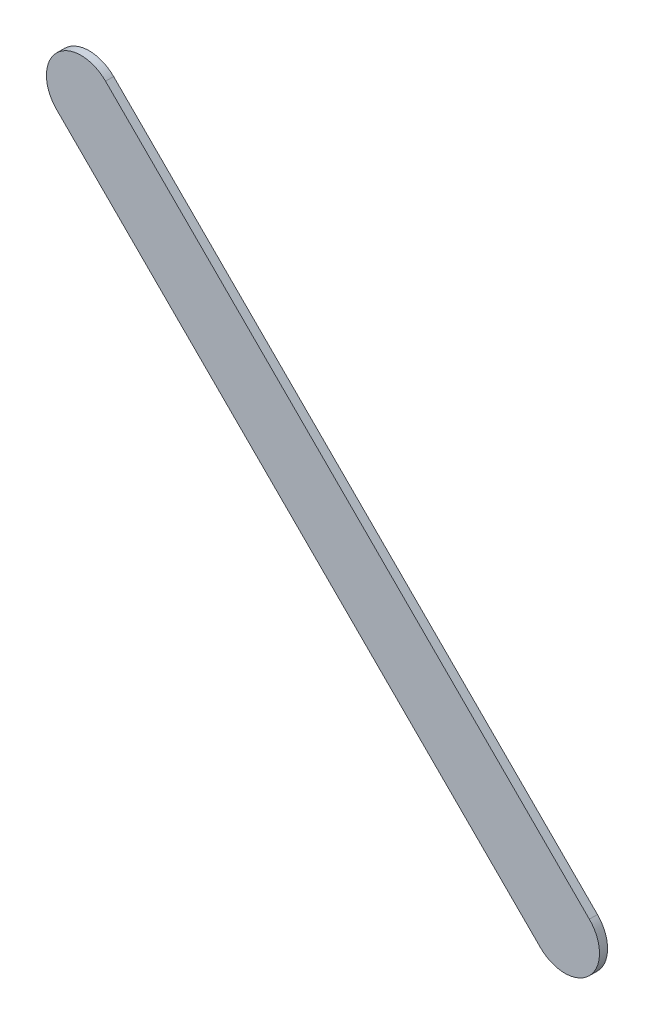
ISO-10303-21;
HEADER;
FILE_DESCRIPTION(('STEP AP214'),'2;1');
FILE_NAME('part.step','',(''),(''),'','','');
FILE_SCHEMA(('AUTOMOTIVE_DESIGN { 1 0 10303 214 1 1 1 1 }'));
ENDSEC;
DATA;
#1=APPLICATION_CONTEXT('core data for automotive mechanical design processes');
#2=APPLICATION_PROTOCOL_DEFINITION('international standard','automotive_design',2000,#1);
#3=PRODUCT_CONTEXT('',#1,'mechanical');
#4=PRODUCT('Part','Part','',(#3));
#5=PRODUCT_RELATED_PRODUCT_CATEGORY('part','',(#4));
#6=PRODUCT_DEFINITION_FORMATION('','',#4);
#7=PRODUCT_DEFINITION_CONTEXT('part definition',#1,'design');
#8=PRODUCT_DEFINITION('design','',#6,#7);
#9=PRODUCT_DEFINITION_SHAPE('','',#8);
#10=(LENGTH_UNIT() NAMED_UNIT(*) SI_UNIT(.MILLI.,.METRE.));
#11=(NAMED_UNIT(*) PLANE_ANGLE_UNIT() SI_UNIT($,.RADIAN.));
#12=(NAMED_UNIT(*) SI_UNIT($,.STERADIAN.) SOLID_ANGLE_UNIT());
#13=UNCERTAINTY_MEASURE_WITH_UNIT(LENGTH_MEASURE(1.E-05),#10,'distance_accuracy_value','');
#14=(GEOMETRIC_REPRESENTATION_CONTEXT(3) GLOBAL_UNCERTAINTY_ASSIGNED_CONTEXT((#13)) GLOBAL_UNIT_ASSIGNED_CONTEXT((#10,
#11,#12)) REPRESENTATION_CONTEXT('',''));
#15=CARTESIAN_POINT('',(0.,0.,0.));
#16=DIRECTION('',(0.,0.,1.));
#17=DIRECTION('',(1.,0.,0.));
#18=AXIS2_PLACEMENT_3D('',#15,#16,#17);
#19=CARTESIAN_POINT('',(123.766066,-113.903933,1.635));
#20=DIRECTION('',(0.,0.,1.));
#21=DIRECTION('',(1.,0.,0.));
#22=AXIS2_PLACEMENT_3D('',#19,#20,#21);
#23=PLANE('',#22);
#24=DIRECTION('',(-0.707106781186548,0.707106781186548,0.));
#25=VECTOR('',#24,1.);
#26=CARTESIAN_POINT('',(123.766066,-113.903933,1.635));
#27=LINE('',#26,#25);
#28=CARTESIAN_POINT('',(123.766066,-113.903933,1.635));
#29=VERTEX_POINT('',#28);
#30=CARTESIAN_POINT('',(121.671066,-111.808933,1.635));
#31=VERTEX_POINT('',#30);
#32=EDGE_CURVE('E91',#29,#31,#27,.T.);
#33=ORIENTED_EDGE('',*,*,#32,.T.);
#34=CARTESIAN_POINT('',(121.5649995,-111.9149995,1.635));
#35=DIRECTION('',(0.,0.,1.));
#36=DIRECTION('',(0.707106781186548,0.707106781186548,0.));
#37=AXIS2_PLACEMENT_3D('',#34,#35,#36);
#38=CIRCLE('',#37,0.150000682813);
#39=CARTESIAN_POINT('',(121.458933,-112.021066,1.635));
#40=VERTEX_POINT('',#39);
#41=EDGE_CURVE('E86',#31,#40,#38,.T.);
#42=ORIENTED_EDGE('',*,*,#41,.T.);
#43=DIRECTION('',(0.707106781186548,-0.707106781186548,0.));
#44=VECTOR('',#43,1.);
#45=CARTESIAN_POINT('',(121.458933,-112.021066,1.635));
#46=LINE('',#45,#44);
#47=CARTESIAN_POINT('',(123.553933,-114.116066,1.635));
#48=VERTEX_POINT('',#47);
#49=EDGE_CURVE('E110',#40,#48,#46,.T.);
#50=ORIENTED_EDGE('',*,*,#49,.T.);
#51=CARTESIAN_POINT('',(123.6599995,-114.0099995,1.635));
#52=DIRECTION('',(0.,0.,1.));
#53=DIRECTION('',(-0.707106781186548,-0.707106781186548,0.));
#54=AXIS2_PLACEMENT_3D('',#51,#52,#53);
#55=CIRCLE('',#54,0.150000682813);
#56=EDGE_CURVE('E11',#48,#29,#55,.T.);
#57=ORIENTED_EDGE('',*,*,#56,.T.);
#58=EDGE_LOOP('',(#33,#42,#50,#57));
#59=FACE_BOUND('',#58,.T.);
#60=ADVANCED_FACE('F17',(#59),#23,.T.);
#61=CARTESIAN_POINT('',(123.766066,-113.903933,1.6));
#62=DIRECTION('',(0.,0.,1.));
#63=DIRECTION('',(1.,0.,0.));
#64=AXIS2_PLACEMENT_3D('',#61,#62,#63);
#65=PLANE('',#64);
#66=CARTESIAN_POINT('',(123.6599995,-114.0099995,1.6));
#67=DIRECTION('',(0.,0.,1.));
#68=DIRECTION('',(-0.707106781186548,-0.707106781186548,0.));
#69=AXIS2_PLACEMENT_3D('',#66,#67,#68);
#70=CIRCLE('',#69,0.150000682813);
#71=CARTESIAN_POINT('',(123.553933,-114.116066,1.6));
#72=VERTEX_POINT('',#71);
#73=CARTESIAN_POINT('',(123.766066,-113.903933,1.6));
#74=VERTEX_POINT('',#73);
#75=EDGE_CURVE('E20',#72,#74,#70,.T.);
#76=ORIENTED_EDGE('',*,*,#75,.F.);
#77=DIRECTION('',(0.707106781186548,-0.707106781186548,0.));
#78=VECTOR('',#77,1.);
#79=CARTESIAN_POINT('',(121.458933,-112.021066,1.6));
#80=LINE('',#79,#78);
#81=CARTESIAN_POINT('',(121.458933,-112.021066,1.6));
#82=VERTEX_POINT('',#81);
#83=EDGE_CURVE('E74',#82,#72,#80,.T.);
#84=ORIENTED_EDGE('',*,*,#83,.F.);
#85=CARTESIAN_POINT('',(121.5649995,-111.9149995,1.6));
#86=DIRECTION('',(0.,0.,1.));
#87=DIRECTION('',(0.707106781186548,0.707106781186548,0.));
#88=AXIS2_PLACEMENT_3D('',#85,#86,#87);
#89=CIRCLE('',#88,0.150000682813);
#90=CARTESIAN_POINT('',(121.671066,-111.808933,1.6));
#91=VERTEX_POINT('',#90);
#92=EDGE_CURVE('E68',#91,#82,#89,.T.);
#93=ORIENTED_EDGE('',*,*,#92,.F.);
#94=DIRECTION('',(-0.707106781186548,0.707106781186548,0.));
#95=VECTOR('',#94,1.);
#96=CARTESIAN_POINT('',(123.766066,-113.903933,1.6));
#97=LINE('',#96,#95);
#98=EDGE_CURVE('E72',#74,#91,#97,.T.);
#99=ORIENTED_EDGE('',*,*,#98,.F.);
#100=EDGE_LOOP('',(#76,#84,#93,#99));
#101=FACE_BOUND('',#100,.T.);
#102=ADVANCED_FACE('F70',(#101),#65,.F.);
#103=CARTESIAN_POINT('',(123.6599995,-114.0099995,1.6));
#104=DIRECTION('',(0.,0.,-1.));
#105=DIRECTION('',(-0.707106781186548,-0.707106781186548,0.));
#106=AXIS2_PLACEMENT_3D('',#103,#104,#105);
#107=CYLINDRICAL_SURFACE('',#106,0.150000682813);
#108=ORIENTED_EDGE('',*,*,#75,.T.);
#109=DIRECTION('',(0.,0.,1.));
#110=VECTOR('',#109,1.);
#111=CARTESIAN_POINT('',(123.766066,-113.903933,1.6));
#112=LINE('',#111,#110);
#113=EDGE_CURVE('E80',#74,#29,#112,.T.);
#114=ORIENTED_EDGE('',*,*,#113,.T.);
#115=ORIENTED_EDGE('',*,*,#56,.F.);
#116=DIRECTION('',(0.,0.,1.));
#117=VECTOR('',#116,1.);
#118=CARTESIAN_POINT('',(123.553933,-114.116066,1.6));
#119=LINE('',#118,#117);
#120=EDGE_CURVE('E107',#72,#48,#119,.T.);
#121=ORIENTED_EDGE('',*,*,#120,.F.);
#122=EDGE_LOOP('',(#108,#114,#115,#121));
#123=FACE_BOUND('',#122,.T.);
#124=ADVANCED_FACE('F122',(#123),#107,.T.);
#125=CARTESIAN_POINT('',(121.458933,-112.021066,1.6));
#126=DIRECTION('',(0.707106781186548,0.707106781186548,0.));
#127=DIRECTION('',(0.,0.,-1.));
#128=AXIS2_PLACEMENT_3D('',#125,#126,#127);
#129=PLANE('',#128);
#130=ORIENTED_EDGE('',*,*,#83,.T.);
#131=ORIENTED_EDGE('',*,*,#120,.T.);
#132=ORIENTED_EDGE('',*,*,#49,.F.);
#133=DIRECTION('',(0.,0.,1.));
#134=VECTOR('',#133,1.);
#135=CARTESIAN_POINT('',(121.458933,-112.021066,1.6));
#136=LINE('',#135,#134);
#137=EDGE_CURVE('E79',#82,#40,#136,.T.);
#138=ORIENTED_EDGE('',*,*,#137,.F.);
#139=EDGE_LOOP('',(#130,#131,#132,#138));
#140=FACE_BOUND('',#139,.T.);
#141=ADVANCED_FACE('F124',(#140),#129,.F.);
#142=CARTESIAN_POINT('',(121.5649995,-111.9149995,1.6));
#143=DIRECTION('',(0.,0.,-1.));
#144=DIRECTION('',(0.707106781186548,0.707106781186548,0.));
#145=AXIS2_PLACEMENT_3D('',#142,#143,#144);
#146=CYLINDRICAL_SURFACE('',#145,0.150000682813);
#147=ORIENTED_EDGE('',*,*,#92,.T.);
#148=ORIENTED_EDGE('',*,*,#137,.T.);
#149=ORIENTED_EDGE('',*,*,#41,.F.);
#150=DIRECTION('',(0.,0.,1.));
#151=VECTOR('',#150,1.);
#152=CARTESIAN_POINT('',(121.671066,-111.808933,1.6));
#153=LINE('',#152,#151);
#154=EDGE_CURVE('E83',#91,#31,#153,.T.);
#155=ORIENTED_EDGE('',*,*,#154,.F.);
#156=EDGE_LOOP('',(#147,#148,#149,#155));
#157=FACE_BOUND('',#156,.T.);
#158=ADVANCED_FACE('F84',(#157),#146,.T.);
#159=CARTESIAN_POINT('',(123.766066,-113.903933,1.6));
#160=DIRECTION('',(-0.707106781186548,-0.707106781186548,0.));
#161=DIRECTION('',(-0.707106781186548,0.707106781186548,0.));
#162=AXIS2_PLACEMENT_3D('',#159,#160,#161);
#163=PLANE('',#162);
#164=ORIENTED_EDGE('',*,*,#98,.T.);
#165=ORIENTED_EDGE('',*,*,#154,.T.);
#166=ORIENTED_EDGE('',*,*,#32,.F.);
#167=ORIENTED_EDGE('',*,*,#113,.F.);
#168=EDGE_LOOP('',(#164,#165,#166,#167));
#169=FACE_BOUND('',#168,.T.);
#170=ADVANCED_FACE('F94',(#169),#163,.F.);
#171=CLOSED_SHELL('',(#60,#102,#124,#141,#158,#170));
#172=MANIFOLD_SOLID_BREP('B1',#171);
#173=ADVANCED_BREP_SHAPE_REPRESENTATION('',(#18,#172),#14);
#174=SHAPE_DEFINITION_REPRESENTATION(#9,#173);
ENDSEC;
END-ISO-10303-21;
